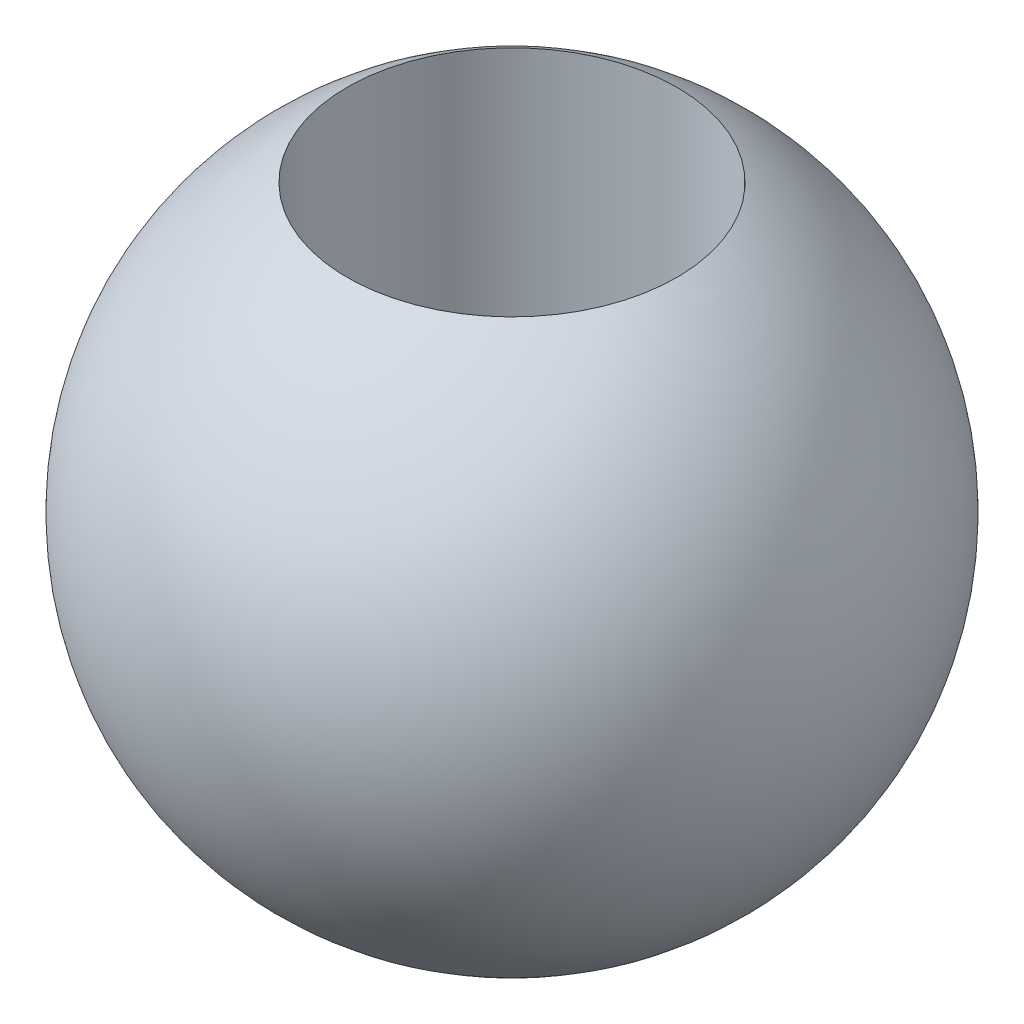
ISO-10303-21;
HEADER;
FILE_DESCRIPTION(('STEP AP214'),'2;1');
FILE_NAME('part.step','',(''),(''),'','','');
FILE_SCHEMA(('AUTOMOTIVE_DESIGN { 1 0 10303 214 1 1 1 1 }'));
ENDSEC;
DATA;
#1=APPLICATION_CONTEXT('core data for automotive mechanical design processes');
#2=APPLICATION_PROTOCOL_DEFINITION('international standard','automotive_design',2000,#1);
#3=PRODUCT_CONTEXT('',#1,'mechanical');
#4=PRODUCT('Part','Part','',(#3));
#5=PRODUCT_RELATED_PRODUCT_CATEGORY('part','',(#4));
#6=PRODUCT_DEFINITION_FORMATION('','',#4);
#7=PRODUCT_DEFINITION_CONTEXT('part definition',#1,'design');
#8=PRODUCT_DEFINITION('design','',#6,#7);
#9=PRODUCT_DEFINITION_SHAPE('','',#8);
#10=(LENGTH_UNIT() NAMED_UNIT(*) SI_UNIT(.MILLI.,.METRE.));
#11=(NAMED_UNIT(*) PLANE_ANGLE_UNIT() SI_UNIT($,.RADIAN.));
#12=(NAMED_UNIT(*) SI_UNIT($,.STERADIAN.) SOLID_ANGLE_UNIT());
#13=UNCERTAINTY_MEASURE_WITH_UNIT(LENGTH_MEASURE(1.E-05),#10,'distance_accuracy_value','');
#14=(GEOMETRIC_REPRESENTATION_CONTEXT(3) GLOBAL_UNCERTAINTY_ASSIGNED_CONTEXT((#13)) GLOBAL_UNIT_ASSIGNED_CONTEXT((#10,
#11,#12)) REPRESENTATION_CONTEXT('',''));
#15=CARTESIAN_POINT('',(0.,0.,0.));
#16=DIRECTION('',(0.,0.,1.));
#17=DIRECTION('',(1.,0.,0.));
#18=AXIS2_PLACEMENT_3D('',#15,#16,#17);
#19=CARTESIAN_POINT('',(0.,0.,0.));
#20=DIRECTION('',(1.,0.,0.));
#21=DIRECTION('',(0.,0.,1.));
#22=AXIS2_PLACEMENT_3D('',#19,#20,#21);
#23=SPHERICAL_SURFACE('',#22,8.);
#24=CARTESIAN_POINT('',(0.,0.,0.));
#25=DIRECTION('',(0.,-1.,0.));
#26=DIRECTION('',(0.,0.,-1.));
#27=AXIS2_PLACEMENT_3D('',#24,#25,#26);
#28=SPHERICAL_SURFACE('',#27,8.);
#29=CARTESIAN_POINT('',(0.,6.92820323027551,0.));
#30=DIRECTION('',(0.,-1.,0.));
#31=DIRECTION('',(0.,0.,-1.));
#32=AXIS2_PLACEMENT_3D('',#29,#30,#31);
#33=CIRCLE('',#32,4.);
#34=CARTESIAN_POINT('',(0.,6.92820323027551,-4.));
#35=VERTEX_POINT('',#34);
#36=EDGE_CURVE('E50',#35,#35,#33,.T.);
#37=ORIENTED_EDGE('',*,*,#36,.T.);
#38=EDGE_LOOP('',(#37));
#39=FACE_BOUND('',#38,.T.);
#40=CARTESIAN_POINT('',(0.,-6.92820323027551,0.));
#41=DIRECTION('',(0.,1.,0.));
#42=DIRECTION('',(0.,0.,1.));
#43=AXIS2_PLACEMENT_3D('',#40,#41,#42);
#44=CIRCLE('',#43,4.);
#45=CARTESIAN_POINT('',(0.,-6.92820323027551,4.));
#46=VERTEX_POINT('',#45);
#47=EDGE_CURVE('E10',#46,#46,#44,.F.);
#48=ORIENTED_EDGE('',*,*,#47,.F.);
#49=EDGE_LOOP('',(#48));
#50=FACE_BOUND('',#49,.T.);
#51=ADVANCED_FACE('F43',(#39,#50),#28,.T.);
#52=CARTESIAN_POINT('',(0.,-8.001,0.));
#53=DIRECTION('',(0.,1.,0.));
#54=DIRECTION('',(0.,0.,1.));
#55=AXIS2_PLACEMENT_3D('',#52,#53,#54);
#56=CYLINDRICAL_SURFACE('',#55,4.);
#57=ORIENTED_EDGE('',*,*,#47,.T.);
#58=EDGE_LOOP('',(#57));
#59=FACE_BOUND('',#58,.T.);
#60=ORIENTED_EDGE('',*,*,#36,.F.);
#61=EDGE_LOOP('',(#60));
#62=FACE_BOUND('',#61,.T.);
#63=ADVANCED_FACE('F59',(#59,#62),#56,.F.);
#64=CLOSED_SHELL('',(#51,#63));
#65=MANIFOLD_SOLID_BREP('B2',#64);
#66=ADVANCED_BREP_SHAPE_REPRESENTATION('',(#18,#65),#14);
#67=SHAPE_DEFINITION_REPRESENTATION(#9,#66);
ENDSEC;
END-ISO-10303-21;
